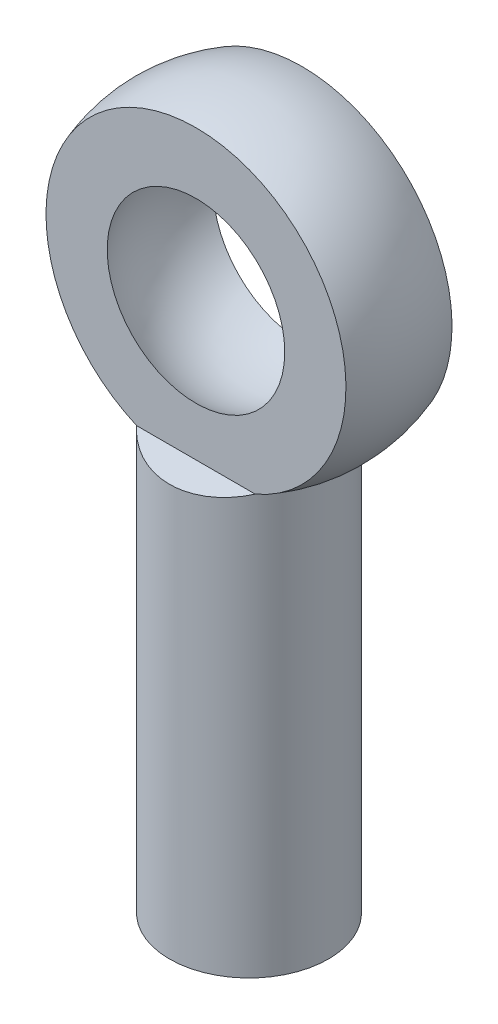
ISO-10303-21;
HEADER;
FILE_DESCRIPTION(('STEP AP214'),'2;1');
FILE_NAME('part.step','',(''),(''),'','','');
FILE_SCHEMA(('AUTOMOTIVE_DESIGN { 1 0 10303 214 1 1 1 1 }'));
ENDSEC;
DATA;
#1=APPLICATION_CONTEXT('core data for automotive mechanical design processes');
#2=APPLICATION_PROTOCOL_DEFINITION('international standard','automotive_design',2000,#1);
#3=PRODUCT_CONTEXT('',#1,'mechanical');
#4=PRODUCT('Part','Part','',(#3));
#5=PRODUCT_RELATED_PRODUCT_CATEGORY('part','',(#4));
#6=PRODUCT_DEFINITION_FORMATION('','',#4);
#7=PRODUCT_DEFINITION_CONTEXT('part definition',#1,'design');
#8=PRODUCT_DEFINITION('design','',#6,#7);
#9=PRODUCT_DEFINITION_SHAPE('','',#8);
#10=(LENGTH_UNIT() NAMED_UNIT(*) SI_UNIT(.MILLI.,.METRE.));
#11=(NAMED_UNIT(*) PLANE_ANGLE_UNIT() SI_UNIT($,.RADIAN.));
#12=(NAMED_UNIT(*) SI_UNIT($,.STERADIAN.) SOLID_ANGLE_UNIT());
#13=UNCERTAINTY_MEASURE_WITH_UNIT(LENGTH_MEASURE(1.E-05),#10,'distance_accuracy_value','');
#14=(GEOMETRIC_REPRESENTATION_CONTEXT(3) GLOBAL_UNCERTAINTY_ASSIGNED_CONTEXT((#13)) GLOBAL_UNIT_ASSIGNED_CONTEXT((#10,
#11,#12)) REPRESENTATION_CONTEXT('',''));
#15=CARTESIAN_POINT('',(0.,0.,0.));
#16=DIRECTION('',(0.,0.,1.));
#17=DIRECTION('',(1.,0.,0.));
#18=AXIS2_PLACEMENT_3D('',#15,#16,#17);
#19=CARTESIAN_POINT('',(0.,-21.,0.));
#20=DIRECTION('',(0.,1.,0.));
#21=DIRECTION('',(0.,0.,1.));
#22=AXIS2_PLACEMENT_3D('',#19,#20,#21);
#23=CYLINDRICAL_SURFACE('',#22,3.);
#24=CARTESIAN_POINT('',(0.,-4.60448295036906,0.));
#25=DIRECTION('',(0.,-0.958918582863203,0.283681425968685));
#26=DIRECTION('',(0.,0.283681425968685,0.958918582863203));
#27=AXIS2_PLACEMENT_3D('',#24,#25,#26);
#28=ELLIPSE('',#27,3.12852420801191,3.);
#29=CARTESIAN_POINT('',(2.23606797749978,-5.19615242270664,-2.));
#30=VERTEX_POINT('',#29);
#31=CARTESIAN_POINT('',(-2.23606797749978,-5.19615242270664,-2.));
#32=VERTEX_POINT('',#31);
#33=EDGE_CURVE('E53',#30,#32,#28,.F.);
#34=ORIENTED_EDGE('',*,*,#33,.F.);
#35=CARTESIAN_POINT('',(0.,-5.19615242270664,0.));
#36=DIRECTION('',(0.,1.,0.));
#37=DIRECTION('',(0.,0.,1.));
#38=AXIS2_PLACEMENT_3D('',#35,#36,#37);
#39=CIRCLE('',#38,3.);
#40=CARTESIAN_POINT('',(2.23606797749977,-5.19615242270664,2.));
#41=VERTEX_POINT('',#40);
#42=EDGE_CURVE('E41',#41,#30,#39,.T.);
#43=ORIENTED_EDGE('',*,*,#42,.F.);
#44=CARTESIAN_POINT('',(0.,-4.60448295036906,0.));
#45=DIRECTION('',(0.,-0.958918582863203,-0.283681425968686));
#46=DIRECTION('',(0.,0.283681425968686,-0.958918582863203));
#47=AXIS2_PLACEMENT_3D('',#44,#45,#46);
#48=ELLIPSE('',#47,3.12852420801191,3.);
#49=CARTESIAN_POINT('',(-2.23606797749977,-5.19615242270664,2.));
#50=VERTEX_POINT('',#49);
#51=EDGE_CURVE('E64',#50,#41,#48,.F.);
#52=ORIENTED_EDGE('',*,*,#51,.F.);
#53=EDGE_CURVE('E76',#32,#50,#39,.T.);
#54=ORIENTED_EDGE('',*,*,#53,.F.);
#55=EDGE_LOOP('',(#34,#43,#52,#54));
#56=FACE_BOUND('',#55,.T.);
#57=CARTESIAN_POINT('',(0.,-21.,0.));
#58=DIRECTION('',(0.,1.,0.));
#59=DIRECTION('',(0.,0.,1.));
#60=AXIS2_PLACEMENT_3D('',#57,#58,#59);
#61=CIRCLE('',#60,3.);
#62=CARTESIAN_POINT('',(0.,-21.,3.));
#63=VERTEX_POINT('',#62);
#64=EDGE_CURVE('E84',#63,#63,#61,.T.);
#65=ORIENTED_EDGE('',*,*,#64,.T.);
#66=EDGE_LOOP('',(#65));
#67=FACE_BOUND('',#66,.T.);
#68=ADVANCED_FACE('F33',(#56,#67),#23,.T.);
#69=CARTESIAN_POINT('',(0.,-21.,0.));
#70=DIRECTION('',(0.,1.,0.));
#71=DIRECTION('',(0.,0.,1.));
#72=AXIS2_PLACEMENT_3D('',#69,#70,#71);
#73=PLANE('',#72);
#74=CARTESIAN_POINT('',(0.,-21.,0.));
#75=DIRECTION('',(0.,-1.,0.));
#76=DIRECTION('',(0.,0.,-1.));
#77=AXIS2_PLACEMENT_3D('',#74,#75,#76);
#78=CIRCLE('',#77,1.6);
#79=CARTESIAN_POINT('',(0.,-21.,-1.6));
#80=VERTEX_POINT('',#79);
#81=EDGE_CURVE('E94',#80,#80,#78,.T.);
#82=ORIENTED_EDGE('',*,*,#81,.F.);
#83=EDGE_LOOP('',(#82));
#84=FACE_BOUND('',#83,.T.);
#85=ORIENTED_EDGE('',*,*,#64,.F.);
#86=EDGE_LOOP('',(#85));
#87=FACE_BOUND('',#86,.T.);
#88=ADVANCED_FACE('F109',(#84,#87),#73,.F.);
#89=CARTESIAN_POINT('',(0.,0.,-2.));
#90=DIRECTION('',(0.,0.,1.));
#91=DIRECTION('',(1.,0.,0.));
#92=AXIS2_PLACEMENT_3D('',#89,#90,#91);
#93=PLANE('',#92);
#94=CARTESIAN_POINT('',(0.,0.,-2.));
#95=DIRECTION('',(0.,0.,1.));
#96=DIRECTION('',(1.,0.,0.));
#97=AXIS2_PLACEMENT_3D('',#94,#95,#96);
#98=CIRCLE('',#97,3.34813380855664);
#99=CARTESIAN_POINT('',(3.34813380855664,0.,-2.));
#100=VERTEX_POINT('',#99);
#101=EDGE_CURVE('E89',#100,#100,#98,.F.);
#102=ORIENTED_EDGE('',*,*,#101,.F.);
#103=EDGE_LOOP('',(#102));
#104=FACE_BOUND('',#103,.T.);
#105=CARTESIAN_POINT('',(0.,0.,-2.));
#106=DIRECTION('',(0.,0.,-1.));
#107=DIRECTION('',(-1.,0.,0.));
#108=AXIS2_PLACEMENT_3D('',#105,#106,#107);
#109=CIRCLE('',#108,5.65685424949238);
#110=EDGE_CURVE('E47',#32,#30,#109,.T.);
#111=ORIENTED_EDGE('',*,*,#110,.T.);
#112=DIRECTION('',(1.,0.,0.));
#113=VECTOR('',#112,1.);
#114=CARTESIAN_POINT('',(-5.,-5.19615242270664,-2.));
#115=LINE('',#114,#113);
#116=EDGE_CURVE('E69',#32,#30,#115,.T.);
#117=ORIENTED_EDGE('',*,*,#116,.F.);
#118=EDGE_LOOP('',(#111,#117));
#119=FACE_BOUND('',#118,.T.);
#120=ADVANCED_FACE('F35',(#104,#119),#93,.F.);
#121=CARTESIAN_POINT('',(0.,0.,2.));
#122=DIRECTION('',(0.,0.,-1.));
#123=DIRECTION('',(-1.,0.,0.));
#124=AXIS2_PLACEMENT_3D('',#121,#122,#123);
#125=PLANE('',#124);
#126=CARTESIAN_POINT('',(0.,0.,2.));
#127=DIRECTION('',(0.,0.,-1.));
#128=DIRECTION('',(-1.,0.,0.));
#129=AXIS2_PLACEMENT_3D('',#126,#127,#128);
#130=CIRCLE('',#129,3.34813380855664);
#131=CARTESIAN_POINT('',(3.34813380855664,0.,2.));
#132=VERTEX_POINT('',#131);
#133=EDGE_CURVE('E11',#132,#132,#130,.F.);
#134=ORIENTED_EDGE('',*,*,#133,.F.);
#135=EDGE_LOOP('',(#134));
#136=FACE_BOUND('',#135,.T.);
#137=CARTESIAN_POINT('',(0.,0.,2.));
#138=DIRECTION('',(0.,0.,-1.));
#139=DIRECTION('',(-1.,0.,0.));
#140=AXIS2_PLACEMENT_3D('',#137,#138,#139);
#141=CIRCLE('',#140,5.65685424949238);
#142=EDGE_CURVE('E81',#50,#41,#141,.T.);
#143=ORIENTED_EDGE('',*,*,#142,.F.);
#144=DIRECTION('',(1.,0.,0.));
#145=VECTOR('',#144,1.);
#146=CARTESIAN_POINT('',(-5.,-5.19615242270664,2.));
#147=LINE('',#146,#145);
#148=EDGE_CURVE('E61',#50,#41,#147,.T.);
#149=ORIENTED_EDGE('',*,*,#148,.T.);
#150=EDGE_LOOP('',(#143,#149));
#151=FACE_BOUND('',#150,.T.);
#152=ADVANCED_FACE('F82',(#136,#151),#125,.F.);
#153=CARTESIAN_POINT('',(0.,0.,0.));
#154=DIRECTION('',(0.,0.,-1.));
#155=DIRECTION('',(1.,0.,0.));
#156=AXIS2_PLACEMENT_3D('',#153,#154,#155);
#157=SPHERICAL_SURFACE('',#156,6.);
#158=ORIENTED_EDGE('',*,*,#142,.T.);
#159=ORIENTED_EDGE('',*,*,#42,.T.);
#160=ORIENTED_EDGE('',*,*,#110,.F.);
#161=ORIENTED_EDGE('',*,*,#53,.T.);
#162=EDGE_LOOP('',(#158,#159,#160,#161));
#163=FACE_BOUND('',#162,.T.);
#164=ADVANCED_FACE('F80',(#163),#157,.T.);
#165=CARTESIAN_POINT('',(0.,0.,0.));
#166=DIRECTION('',(0.,0.,-1.));
#167=DIRECTION('',(1.,0.,0.));
#168=AXIS2_PLACEMENT_3D('',#165,#166,#167);
#169=SPHERICAL_SURFACE('',#168,3.9);
#170=CARTESIAN_POINT('',(3.34813380855664,0.,-2.));
#171=CARTESIAN_POINT('',(3.37057019510456,0.,-1.96244057140002));
#172=CARTESIAN_POINT('',(3.39237404959348,0.,-1.92450332156261));
#173=CARTESIAN_POINT('',(3.43469315259225,0.,-1.84791677922678));
#174=CARTESIAN_POINT('',(3.4552084011021,0.,-1.80926748672837));
#175=CARTESIAN_POINT('',(3.49492675028161,0.,-1.7313004588844));
#176=CARTESIAN_POINT('',(3.51412985095127,0.,-1.69198272353884));
#177=CARTESIAN_POINT('',(3.5512022396231,0.,-1.61272338289484));
#178=CARTESIAN_POINT('',(3.56907152762526,0.,-1.57278177759639));
#179=CARTESIAN_POINT('',(3.60345603189803,0.,-1.492319918576));
#180=CARTESIAN_POINT('',(3.61997124816864,0.,-1.45179966485407));
#181=CARTESIAN_POINT('',(3.65162891147167,0.,-1.37022640134713));
#182=CARTESIAN_POINT('',(3.66677135850407,0.,-1.32917339156212));
#183=CARTESIAN_POINT('',(3.69566633295904,0.,-1.24658110747758));
#184=CARTESIAN_POINT('',(3.7094188603816,0.,-1.20504183317803));
#185=CARTESIAN_POINT('',(3.73551842134125,0.,-1.12152406342003));
#186=CARTESIAN_POINT('',(3.74786545487833,0.,-1.07954556796158));
#187=CARTESIAN_POINT('',(3.77114004496949,0.,-0.995196896359764));
#188=CARTESIAN_POINT('',(3.78206760152355,0.,-0.952826720216404));
#189=CARTESIAN_POINT('',(3.80249086224983,0.,-0.867742671376113));
#190=CARTESIAN_POINT('',(3.81198656642204,0.,-0.825028798679182));
#191=CARTESIAN_POINT('',(3.82953536851611,0.,-0.739305730077109));
#192=CARTESIAN_POINT('',(3.83758846643796,0.,-0.696296534171966));
#193=CARTESIAN_POINT('',(3.85224293592102,0.,-0.610031526957338));
#194=CARTESIAN_POINT('',(3.85884430748222,0.,-0.566775715647853));
#195=CARTESIAN_POINT('',(3.87058784820726,0.,-0.480066464718172));
#196=CARTESIAN_POINT('',(3.87573001737108,0.,-0.436613025097977));
#197=CARTESIAN_POINT('',(3.88454932980829,0.,-0.349557728454474));
#198=CARTESIAN_POINT('',(3.88822647308168,0.,-0.305955871431165));
#199=CARTESIAN_POINT('',(3.89411156938275,0.,-0.218653118971241));
#200=CARTESIAN_POINT('',(3.89631952241043,0.,-0.174952223534626));
#201=CARTESIAN_POINT('',(3.89926373771906,0.,-0.0875008853986743));
#202=CARTESIAN_POINT('',(3.9,0.,-0.0437504426993372));
#203=CARTESIAN_POINT('',(3.9,0.,0.0437504426993372));
#204=CARTESIAN_POINT('',(3.89926373771906,0.,0.0875008853986743));
#205=CARTESIAN_POINT('',(3.89631952241044,0.,0.174952223534626));
#206=CARTESIAN_POINT('',(3.89411156938275,0.,0.218653118971241));
#207=CARTESIAN_POINT('',(3.88822647308168,0.,0.305955871431165));
#208=CARTESIAN_POINT('',(3.88454932980829,0.,0.349557728454473));
#209=CARTESIAN_POINT('',(3.87573001737108,0.,0.436613025097977));
#210=CARTESIAN_POINT('',(3.87058784820726,0.,0.480066464718172));
#211=CARTESIAN_POINT('',(3.85884430748222,0.,0.566775715647852));
#212=CARTESIAN_POINT('',(3.85224293592102,0.,0.610031526957338));
#213=CARTESIAN_POINT('',(3.83758846643796,0.,0.696296534171966));
#214=CARTESIAN_POINT('',(3.82953536851611,0.,0.739305730077109));
#215=CARTESIAN_POINT('',(3.81198656642204,0.,0.825028798679182));
#216=CARTESIAN_POINT('',(3.80249086224983,0.,0.867742671376113));
#217=CARTESIAN_POINT('',(3.78206760152355,0.,0.952826720216404));
#218=CARTESIAN_POINT('',(3.77114004496949,0.,0.995196896359764));
#219=CARTESIAN_POINT('',(3.74786545487833,0.,1.07954556796158));
#220=CARTESIAN_POINT('',(3.73551842134125,0.,1.12152406342003));
#221=CARTESIAN_POINT('',(3.7094188603816,0.,1.20504183317803));
#222=CARTESIAN_POINT('',(3.69566633295904,0.,1.24658110747758));
#223=CARTESIAN_POINT('',(3.66677135850407,0.,1.32917339156212));
#224=CARTESIAN_POINT('',(3.65162891147167,0.,1.37022640134713));
#225=CARTESIAN_POINT('',(3.61997124816864,0.,1.45179966485407));
#226=CARTESIAN_POINT('',(3.60345603189803,0.,1.492319918576));
#227=CARTESIAN_POINT('',(3.56907152762526,0.,1.57278177759639));
#228=CARTESIAN_POINT('',(3.5512022396231,0.,1.61272338289484));
#229=CARTESIAN_POINT('',(3.51412985095127,0.,1.69198272353884));
#230=CARTESIAN_POINT('',(3.49492675028161,0.,1.7313004588844));
#231=CARTESIAN_POINT('',(3.4552084011021,0.,1.80926748672837));
#232=CARTESIAN_POINT('',(3.43469315259225,0.,1.84791677922678));
#233=CARTESIAN_POINT('',(3.39237404959348,0.,1.92450332156261));
#234=CARTESIAN_POINT('',(3.37057019510456,0.,1.96244057140002));
#235=CARTESIAN_POINT('',(3.34813380855664,0.,2.));
#236=B_SPLINE_CURVE_WITH_KNOTS('',3,(#170,#171,#172,#173,#174,#175,#176,#177,#178,#179,#180,
#181,#182,#183,#184,#185,#186,#187,#188,#189,#190,#191,#192,#193,#194,#195,#196,#197,#198,#199,
#200,#201,#202,#203,#204,#205,#206,#207,#208,#209,#210,#211,#212,#213,#214,#215,#216,#217,#218,
#219,#220,#221,#222,#223,#224,#225,#226,#227,#228,#229,#230,#231,#232,#233,#234,#235),
.UNSPECIFIED.,.F.,.F.,(4,2,2,2,2,2,2,2,2,2,2,2,2,2,2,2,2,2,2,2,2,2,2,2,2,2,2,2,2,2,2,2,4),(0.,
0.131245135128734,0.262490270257468,0.393735405386202,0.524980540514936,0.656225675643671,
0.787470810772405,0.918715945901139,1.04996108102987,1.18120621615861,1.31245135128734,
1.44369648641608,1.57494162154481,1.70618675667354,1.83743189180228,1.96867702693101,
2.09992216205975,2.23116729718848,2.36241243231721,2.49365756744595,2.62490270257468,
2.75614783770342,2.88739297283215,3.01863810796089,3.14988324308962,3.28112837821835,
3.41237351334709,3.54361864847582,3.67486378360456,3.80610891873329,3.93735405386202,
4.06859918899076,4.19984432411949),.UNSPECIFIED.);
#237=EDGE_CURVE('BSEAM121',#100,#132,#236,.T.);
#238=ORIENTED_EDGE('',*,*,#101,.T.);
#239=ORIENTED_EDGE('',*,*,#133,.T.);
#240=ORIENTED_EDGE('',*,*,#237,.T.);
#241=ORIENTED_EDGE('',*,*,#237,.F.);
#242=EDGE_LOOP('',(#238,#240,#239,#241));
#243=FACE_BOUND('',#242,.T.);
#244=ADVANCED_FACE('F121',(#243),#169,.F.);
#245=CARTESIAN_POINT('',(-5.,-5.19615242270664,2.));
#246=DIRECTION('',(0.,-0.958918582863203,-0.283681425968686));
#247=DIRECTION('',(0.,0.283681425968686,-0.958918582863203));
#248=AXIS2_PLACEMENT_3D('',#245,#246,#247);
#249=PLANE('',#248);
#250=ORIENTED_EDGE('',*,*,#51,.T.);
#251=ORIENTED_EDGE('',*,*,#148,.F.);
#252=EDGE_LOOP('',(#250,#251));
#253=FACE_BOUND('',#252,.T.);
#254=ADVANCED_FACE('F63',(#253),#249,.F.);
#255=CARTESIAN_POINT('',(-5.,-5.19615242270664,-2.));
#256=DIRECTION('',(0.,-0.958918582863203,0.283681425968685));
#257=DIRECTION('',(0.,-0.283681425968685,-0.958918582863203));
#258=AXIS2_PLACEMENT_3D('',#255,#256,#257);
#259=PLANE('',#258);
#260=ORIENTED_EDGE('',*,*,#33,.T.);
#261=ORIENTED_EDGE('',*,*,#116,.T.);
#262=EDGE_LOOP('',(#260,#261));
#263=FACE_BOUND('',#262,.T.);
#264=ADVANCED_FACE('F105',(#263),#259,.F.);
#265=CARTESIAN_POINT('',(0.,-11.,0.));
#266=DIRECTION('',(0.,-1.,0.));
#267=DIRECTION('',(0.,0.,-1.));
#268=AXIS2_PLACEMENT_3D('',#265,#266,#267);
#269=CYLINDRICAL_SURFACE('',#268,1.6);
#270=CARTESIAN_POINT('',(0.,-11.,0.));
#271=DIRECTION('',(0.,-1.,0.));
#272=DIRECTION('',(0.,0.,-1.));
#273=AXIS2_PLACEMENT_3D('',#270,#271,#272);
#274=CIRCLE('',#273,1.6);
#275=CARTESIAN_POINT('',(0.,-11.,-1.6));
#276=VERTEX_POINT('',#275);
#277=EDGE_CURVE('E70',#276,#276,#274,.T.);
#278=ORIENTED_EDGE('',*,*,#277,.F.);
#279=EDGE_LOOP('',(#278));
#280=FACE_BOUND('',#279,.T.);
#281=ORIENTED_EDGE('',*,*,#81,.T.);
#282=EDGE_LOOP('',(#281));
#283=FACE_BOUND('',#282,.T.);
#284=ADVANCED_FACE('F102',(#280,#283),#269,.F.);
#285=CARTESIAN_POINT('',(0.,-11.,0.));
#286=DIRECTION('',(0.,-1.,0.));
#287=DIRECTION('',(0.,0.,-1.));
#288=AXIS2_PLACEMENT_3D('',#285,#286,#287);
#289=PLANE('',#288);
#290=ORIENTED_EDGE('',*,*,#277,.T.);
#291=EDGE_LOOP('',(#290));
#292=FACE_BOUND('',#291,.T.);
#293=ADVANCED_FACE('F100',(#292),#289,.T.);
#294=CLOSED_SHELL('',(#68,#88,#120,#152,#164,#244,#254,#264,#284,#293));
#295=MANIFOLD_SOLID_BREP('B2',#294);
#296=ADVANCED_BREP_SHAPE_REPRESENTATION('',(#18,#295),#14);
#297=SHAPE_DEFINITION_REPRESENTATION(#9,#296);
ENDSEC;
END-ISO-10303-21;
